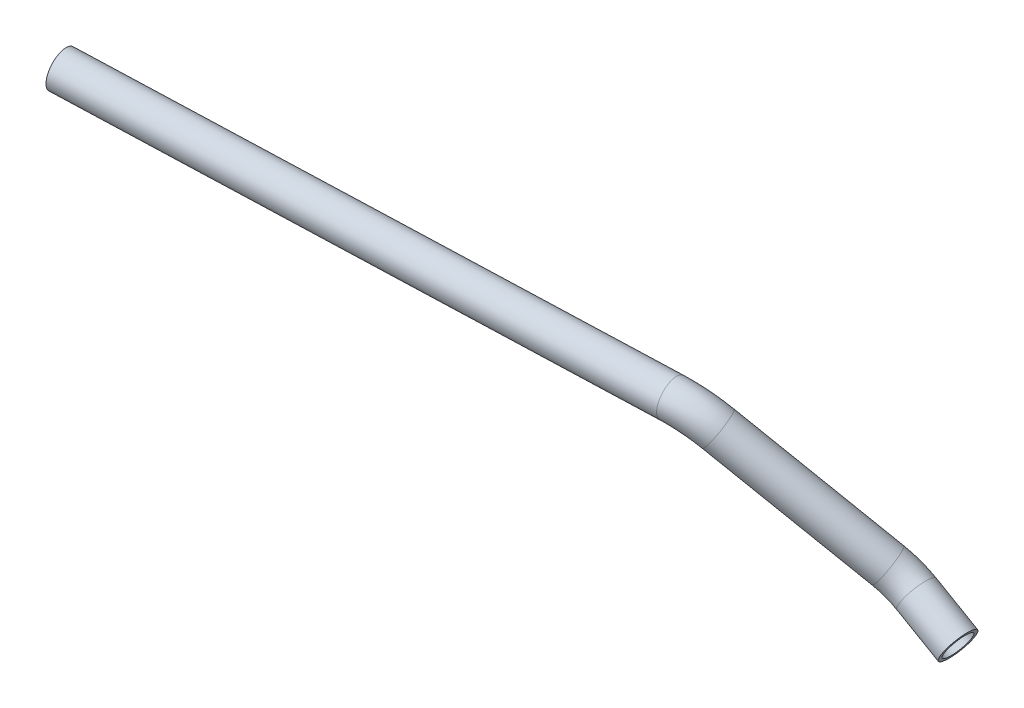
ISO-10303-21;
HEADER;
FILE_DESCRIPTION(('STEP AP214'),'2;1');
FILE_NAME('part.step','',(''),(''),'','','');
FILE_SCHEMA(('AUTOMOTIVE_DESIGN { 1 0 10303 214 1 1 1 1 }'));
ENDSEC;
DATA;
#1=APPLICATION_CONTEXT('core data for automotive mechanical design processes');
#2=APPLICATION_PROTOCOL_DEFINITION('international standard','automotive_design',2000,#1);
#3=PRODUCT_CONTEXT('',#1,'mechanical');
#4=PRODUCT('Part','Part','',(#3));
#5=PRODUCT_RELATED_PRODUCT_CATEGORY('part','',(#4));
#6=PRODUCT_DEFINITION_FORMATION('','',#4);
#7=PRODUCT_DEFINITION_CONTEXT('part definition',#1,'design');
#8=PRODUCT_DEFINITION('design','',#6,#7);
#9=PRODUCT_DEFINITION_SHAPE('','',#8);
#10=(LENGTH_UNIT() NAMED_UNIT(*) SI_UNIT(.MILLI.,.METRE.));
#11=(NAMED_UNIT(*) PLANE_ANGLE_UNIT() SI_UNIT($,.RADIAN.));
#12=(NAMED_UNIT(*) SI_UNIT($,.STERADIAN.) SOLID_ANGLE_UNIT());
#13=UNCERTAINTY_MEASURE_WITH_UNIT(LENGTH_MEASURE(1.E-05),#10,'distance_accuracy_value','');
#14=(GEOMETRIC_REPRESENTATION_CONTEXT(3) GLOBAL_UNCERTAINTY_ASSIGNED_CONTEXT((#13)) GLOBAL_UNIT_ASSIGNED_CONTEXT((#10,
#11,#12)) REPRESENTATION_CONTEXT('',''));
#15=CARTESIAN_POINT('',(0.,0.,0.));
#16=DIRECTION('',(0.,0.,1.));
#17=DIRECTION('',(1.,0.,0.));
#18=AXIS2_PLACEMENT_3D('',#15,#16,#17);
#19=CARTESIAN_POINT('',(-10.2697976298578,5.92927042612137,0.));
#20=DIRECTION('',(0.866025403784438,-0.500000000000001,0.));
#21=DIRECTION('',(0.500000000000001,0.866025403784438,0.));
#22=AXIS2_PLACEMENT_3D('',#19,#20,#21);
#23=CYLINDRICAL_SURFACE('',#22,10.);
#24=CARTESIAN_POINT('',(-10.2697976298578,5.92927042612137,0.));
#25=DIRECTION('',(-0.866025403784438,0.500000000000001,0.));
#26=DIRECTION('',(0.0703914326031933,0.121921537686291,0.990040496577933));
#27=AXIS2_PLACEMENT_3D('',#24,#25,#26);
#28=CIRCLE('',#27,10.);
#29=CARTESIAN_POINT('',(-12.0494275557873,2.84686097574138,-9.34514148137651));
#30=VERTEX_POINT('',#29);
#31=EDGE_CURVE('E114',#30,#30,#28,.T.);
#32=ORIENTED_EDGE('',*,*,#31,.F.);
#33=EDGE_LOOP('',(#32));
#34=FACE_BOUND('',#33,.T.);
#35=CARTESIAN_POINT('',(12.9903810567664,-7.49999999999996,0.));
#36=DIRECTION('',(-0.866025403784438,0.500000000000001,0.));
#37=DIRECTION('',(0.0703914326031933,0.121921537686291,0.990040496577933));
#38=AXIS2_PLACEMENT_3D('',#35,#36,#37);
#39=CIRCLE('',#38,10.);
#40=CARTESIAN_POINT('',(13.6942953827984,-6.28078462313704,9.90040496577936));
#41=VERTEX_POINT('',#40);
#42=EDGE_CURVE('E46',#41,#41,#39,.T.);
#43=ORIENTED_EDGE('',*,*,#42,.T.);
#44=EDGE_LOOP('',(#43));
#45=FACE_BOUND('',#44,.T.);
#46=ADVANCED_FACE('F33',(#34,#45),#23,.T.);
#47=CARTESIAN_POINT('',(-10.2697976298578,5.92927042612137,0.));
#48=DIRECTION('',(0.866025403784438,-0.500000000000001,0.));
#49=DIRECTION('',(0.500000000000001,0.866025403784438,0.));
#50=AXIS2_PLACEMENT_3D('',#47,#48,#49);
#51=CYLINDRICAL_SURFACE('',#50,8.00000000000001);
#52=CARTESIAN_POINT('',(8.06217782649094,-3.49999999999992,-7.93725393313693));
#53=CARTESIAN_POINT('',(8.06217478599125,-3.3868147194185,-7.92490374768489));
#54=CARTESIAN_POINT('',(8.05254486445534,-3.27372120669309,-7.91131468549269));
#55=CARTESIAN_POINT('',(8.0143703836225,-3.05083533555484,-7.88316799635768));
#56=CARTESIAN_POINT('',(7.98581043385471,-2.94104573927897,-7.86860958999037));
#57=CARTESIAN_POINT('',(7.91054713247679,-2.72778876856143,-7.84016337768201));
#58=CARTESIAN_POINT('',(7.86384684359413,-2.62432033029679,-7.82627545898382));
#59=CARTESIAN_POINT('',(7.75349593584393,-2.42656681091997,-7.8007646557242));
#60=CARTESIAN_POINT('',(7.68984970216507,-2.33227936260465,-7.78914118652521));
#61=CARTESIAN_POINT('',(7.54775472395503,-2.15621059387384,-7.76961018579242));
#62=CARTESIAN_POINT('',(7.46940884095756,-2.07434912100449,-7.76167809111523));
#63=CARTESIAN_POINT('',(7.29983967111227,-1.92489401345941,-7.75039341012516));
#64=CARTESIAN_POINT('',(7.20861875634432,-1.85729775628941,-7.74703998145656));
#65=CARTESIAN_POINT('',(7.01880910287182,-1.74018880848084,-7.74535826955316));
#66=CARTESIAN_POINT('',(6.92050732781808,-1.69021238176538,-7.7468883852453));
#67=CARTESIAN_POINT('',(6.71719208841107,-1.60711417134894,-7.75447937950912));
#68=CARTESIAN_POINT('',(6.61217873360344,-1.57399211263194,-7.76054018414867));
#69=CARTESIAN_POINT('',(6.39897348684287,-1.52554738714832,-7.77643815056397));
#70=CARTESIAN_POINT('',(6.29080012442414,-1.51013650391132,-7.78625626858658));
#71=CARTESIAN_POINT('',(6.07366078865178,-1.49707631600811,-7.80856902915444));
#72=CARTESIAN_POINT('',(5.96469469538854,-1.49942975665448,-7.82106408510585));
#73=CARTESIAN_POINT('',(5.74587647389668,-1.5220289721801,-7.84773633959301));
#74=CARTESIAN_POINT('',(5.63607748596598,-1.54274760004424,-7.86194936084698));
#75=CARTESIAN_POINT('',(5.42142043051104,-1.60214999267251,-7.89022260631002));
#76=CARTESIAN_POINT('',(5.31656297283914,-1.64083596849076,-7.90428281149561));
#77=CARTESIAN_POINT('',(5.11282854149565,-1.73603001726403,-7.93095587591112));
#78=CARTESIAN_POINT('',(5.01408463771778,-1.79283178119338,-7.94353984551123));
#79=CARTESIAN_POINT('',(4.82742989991539,-1.92256223889068,-7.96555637483007));
#80=CARTESIAN_POINT('',(4.73951762997588,-1.99548879145729,-7.97498935255001));
#81=CARTESIAN_POINT('',(4.57862603109234,-2.15404137261695,-7.98949531184776));
#82=CARTESIAN_POINT('',(4.50541155587918,-2.23942187016009,-7.99464195711137));
#83=CARTESIAN_POINT('',(4.37426429563043,-2.42133616130928,-8.00026927352975));
#84=CARTESIAN_POINT('',(4.31632903563768,-2.51786814492846,-8.00075070081779));
#85=CARTESIAN_POINT('',(4.21867162401703,-2.71675998385006,-7.99704121616749));
#86=CARTESIAN_POINT('',(4.17854444658413,-2.81892349787001,-7.99296254938514));
#87=CARTESIAN_POINT('',(4.1155523293576,-3.02820316347132,-7.98075459485453));
#88=CARTESIAN_POINT('',(4.09268796989231,-3.13531948142384,-7.97262517094623));
#89=CARTESIAN_POINT('',(4.06463906339959,-3.35215312769744,-7.95312348964278));
#90=CARTESIAN_POINT('',(4.0595540059711,-3.4618816441787,-7.94173336850681));
#91=CARTESIAN_POINT('',(4.06733552459349,-3.68047214625907,-7.91692521572489));
#92=CARTESIAN_POINT('',(4.08020514091371,-3.7893339819635,-7.90350684097735));
#93=CARTESIAN_POINT('',(4.12408292391086,-4.00632847000852,-7.87566572913506));
#94=CARTESIAN_POINT('',(4.15557202629261,-4.11436185550258,-7.86122564701563));
#95=CARTESIAN_POINT('',(4.23624516791687,-4.32374685176637,-7.83327255871569));
#96=CARTESIAN_POINT('',(4.28543053552359,-4.42509796025725,-7.81975962222176));
#97=CARTESIAN_POINT('',(4.40076333300351,-4.61917315779605,-7.79509190852995));
#98=CARTESIAN_POINT('',(4.46705198301816,-4.71181621168889,-7.78395824771177));
#99=CARTESIAN_POINT('',(4.61461171583183,-4.88472488652692,-7.76554256063966));
#100=CARTESIAN_POINT('',(4.69587978117963,-4.96499299430982,-7.7582597598101));
#101=CARTESIAN_POINT('',(4.86890056840939,-5.10886160032097,-7.74857824888599));
#102=CARTESIAN_POINT('',(4.96034647329295,-5.17282329571651,-7.74606388672052));
#103=CARTESIAN_POINT('',(5.15259157080217,-5.28466122389379,-7.74587512062454));
#104=CARTESIAN_POINT('',(5.25338965810858,-5.33253935448316,-7.74820014542918));
#105=CARTESIAN_POINT('',(5.45930511479483,-5.41008246544968,-7.75731201109152));
#106=CARTESIAN_POINT('',(5.56429986761818,-5.44008451958381,-7.76401092819155));
#107=CARTESIAN_POINT('',(5.777483741264,-5.4826162077832,-7.78101040537414));
#108=CARTESIAN_POINT('',(5.88567319364414,-5.49514402175315,-7.79131134049872));
#109=CARTESIAN_POINT('',(6.10417631622196,-5.50259425711637,-7.81456461661609));
#110=CARTESIAN_POINT('',(6.21449553254976,-5.49722217119914,-7.82755797931081));
#111=CARTESIAN_POINT('',(6.43262805878351,-5.46846991014122,-7.85466227744665));
#112=CARTESIAN_POINT('',(6.54044093709116,-5.44508665674784,-7.86877340355259));
#113=CARTESIAN_POINT('',(6.75363675383314,-5.38006155429071,-7.89698163821767));
#114=CARTESIAN_POINT('',(6.85887777551744,-5.33794849939385,-7.91106829607877));
#115=CARTESIAN_POINT('',(7.06094503495474,-5.23644623070366,-7.93726756680363));
#116=CARTESIAN_POINT('',(7.15777158863445,-5.17705766589498,-7.94938025379638));
#117=CARTESIAN_POINT('',(7.33989144940927,-5.04278895221189,-7.97023620049024));
#118=CARTESIAN_POINT('',(7.42522552307477,-4.96796608027079,-7.97899158516593));
#119=CARTESIAN_POINT('',(7.58217645453357,-4.80476612662237,-7.9921984728253));
#120=CARTESIAN_POINT('',(7.65379450188576,-4.71639022153614,-7.99665034917787));
#121=CARTESIAN_POINT('',(7.77936476894339,-4.53123686960082,-8.00068336973662));
#122=CARTESIAN_POINT('',(7.83373861409928,-4.43474769842867,-8.00039172483479));
#123=CARTESIAN_POINT('',(7.92577667575456,-4.23426830761943,-7.9952792469473));
#124=CARTESIAN_POINT('',(7.96345110038325,-4.13028271577149,-7.99046118653326));
#125=CARTESIAN_POINT('',(8.01550505373281,-3.93860008521625,-7.97816977111501));
#126=CARTESIAN_POINT('',(8.0329962318095,-3.85168567616473,-7.97139831013582));
#127=CARTESIAN_POINT('',(8.05633413616127,-3.67649564648312,-7.95575350077177));
#128=CARTESIAN_POINT('',(8.06218019634613,-3.58821994827953,-7.94688003218644));
#129=CARTESIAN_POINT('',(8.06217782649094,-3.49999999999992,-7.93725393313693));
#130=B_SPLINE_CURVE_WITH_KNOTS('',3,(#52,#53,#54,#55,#56,#57,#58,#59,#60,#61,#62,#63,#64,#65,
#66,#67,#68,#69,#70,#71,#72,#73,#74,#75,#76,#77,#78,#79,#80,#81,#82,#83,#84,#85,#86,#87,#88,#89,
#90,#91,#92,#93,#94,#95,#96,#97,#98,#99,#100,#101,#102,#103,#104,#105,#106,#107,#108,#109,#110,
#111,#112,#113,#114,#115,#116,#117,#118,#119,#120,#121,#122,#123,#124,#125,#126,#127,#128,#129),
.UNSPECIFIED.,.T.,.F.,(4,2,2,2,2,2,2,2,2,2,2,2,2,2,2,2,2,2,2,2,2,2,2,2,2,2,2,2,2,2,2,2,2,2,2,2,
2,2,4),(0.,0.34124814598429,0.682774074034849,1.02424236553805,1.36562237928526,1.7046971035357,
2.04370943842851,2.37298218689826,2.70224956238766,3.0298697044704,3.35754047826411,
3.6939011451632,4.0303032154333,4.37246276233034,4.71457690131674,5.05068259496939,
5.38673381207893,5.71469187636746,6.04266096521112,6.3724623951495,6.70231967722425,
7.04109401334996,7.37989378476474,7.72158588275912,8.06320922542177,8.39643537445941,
8.72962219008708,9.05630935584843,9.38303054640208,9.71515365412977,10.0473335369531,
10.3883898682872,10.7294333889001,11.0692333546117,11.409003836908,11.7396778013094,
12.070149349495,12.3361130137614,12.6020918904723),.UNSPECIFIED.);
#131=CARTESIAN_POINT('',(8.06217782649094,-3.49999999999992,-7.93725393313693));
#132=VERTEX_POINT('',#131);
#133=EDGE_CURVE('E10',#132,#132,#130,.T.);
#134=ORIENTED_EDGE('',*,*,#133,.F.);
#135=EDGE_LOOP('',(#134));
#136=FACE_BOUND('',#135,.T.);
#137=CARTESIAN_POINT('',(8.06217782649094,-3.49999999999992,7.93725393325062));
#138=CARTESIAN_POINT('',(8.06217564053699,-3.60989176571201,7.94924285693887));
#139=CARTESIAN_POINT('',(8.05309916425535,-3.71993803622657,7.96007089619005));
#140=CARTESIAN_POINT('',(8.01688460293893,-3.93734332318027,7.97824552477793));
#141=CARTESIAN_POINT('',(7.98974250982244,-4.04470173779944,7.98559134092076));
#142=CARTESIAN_POINT('',(7.91800294944832,-4.25374409295078,7.99600407824409));
#143=CARTESIAN_POINT('',(7.87339240804499,-4.35542371794783,7.99906778664297));
#144=CARTESIAN_POINT('',(7.76796016251197,-4.55002443983084,8.00056546507311));
#145=CARTESIAN_POINT('',(7.70714024428513,-4.64294650007451,7.99899994494785));
#146=CARTESIAN_POINT('',(7.57196669885257,-4.81622942528777,7.99146377000274));
#147=CARTESIAN_POINT('',(7.49779596814189,-4.89673564692192,7.98554966910932));
#148=CARTESIAN_POINT('',(7.33755350402537,-5.04443971557158,7.97001376281799));
#149=CARTESIAN_POINT('',(7.25148071605406,-5.11163638202748,7.96039162873973));
#150=CARTESIAN_POINT('',(7.06866204912666,-5.23179312944292,7.93830741298));
#151=CARTESIAN_POINT('',(6.971794404561,-5.28456137966059,7.92581078532208));
#152=CARTESIAN_POINT('',(6.77087903668193,-5.37345003882091,7.89936520195478));
#153=CARTESIAN_POINT('',(6.66683006278527,-5.4095675396878,7.88541599307126));
#154=CARTESIAN_POINT('',(6.45138679978217,-5.46499672698059,7.85716166074223));
#155=CARTESIAN_POINT('',(6.33987087019911,-5.48383710146221,7.84285691357853));
#156=CARTESIAN_POINT('',(6.11505507872777,-5.50247990542869,7.8158738863039));
#157=CARTESIAN_POINT('',(6.00175519510773,-5.5022821028147,7.80319562602373));
#158=CARTESIAN_POINT('',(5.7764270631449,-5.48271024115657,7.78093853117743));
#159=CARTESIAN_POINT('',(5.66439961837707,-5.46332467907515,7.77136156040122));
#160=CARTESIAN_POINT('',(5.4449882892551,-5.40576313057062,7.75649079006911));
#161=CARTESIAN_POINT('',(5.33760338171273,-5.36759130773381,7.75119604213405));
#162=CARTESIAN_POINT('',(5.13364681584992,-5.27483264397386,7.74563470788963));
#163=CARTESIAN_POINT('',(5.03685731597129,-5.22073250191898,7.74523221093265));
#164=CARTESIAN_POINT('',(4.85360497414581,-5.09735737684167,7.74915178052354));
#165=CARTESIAN_POINT('',(4.76714147790304,-5.02808335608463,7.75347354754722));
#166=CARTESIAN_POINT('',(4.60798328544992,-4.8773824088467,7.76623971729903));
#167=CARTESIAN_POINT('',(4.535130136551,-4.79611804146974,7.77463196552094));
#168=CARTESIAN_POINT('',(4.40372483143421,-4.62309368695471,7.79456096824324));
#169=CARTESIAN_POINT('',(4.34517459135638,-4.53133229596069,7.8060981436274));
#170=CARTESIAN_POINT('',(4.24263371472163,-4.33758152437843,7.8313435743665));
#171=CARTESIAN_POINT('',(4.19900206486117,-4.23540784706927,7.84509500671211));
#172=CARTESIAN_POINT('',(4.12922413037599,-4.02530668884024,7.87306787038846));
#173=CARTESIAN_POINT('',(4.10308051740422,-3.91737833149412,7.88728937318391));
#174=CARTESIAN_POINT('',(4.06859339987651,-3.69606539323528,7.91498742203487));
#175=CARTESIAN_POINT('',(4.06066542666518,-3.58261263033371,7.92843987591229));
#176=CARTESIAN_POINT('',(4.06416560789765,-3.35572030198782,7.95273433107179));
#177=CARTESIAN_POINT('',(4.07559215723965,-3.24228073622928,7.96357654873979));
#178=CARTESIAN_POINT('',(4.11738911972234,-3.01995425132473,7.98131915875191));
#179=CARTESIAN_POINT('',(4.14754365265912,-2.91103033558887,7.98826277771333));
#180=CARTESIAN_POINT('',(4.22583997508143,-2.69965009433073,7.99760638084385));
#181=CARTESIAN_POINT('',(4.27397840893521,-2.59719256640593,8.00000721214912));
#182=CARTESIAN_POINT('',(4.38532598695394,-2.40445097372645,7.99999294228559));
#183=CARTESIAN_POINT('',(4.44810203231463,-2.31391629370147,7.99770375599539));
#184=CARTESIAN_POINT('',(4.58751642718014,-2.1444892166928,7.98881315822789));
#185=CARTESIAN_POINT('',(4.66415469844006,-2.06559675399954,7.98221177109011));
#186=CARTESIAN_POINT('',(4.82894788797131,-1.92167901111281,7.96541932098452));
#187=CARTESIAN_POINT('',(4.91708635980826,-1.85663427038432,7.95523334968191));
#188=CARTESIAN_POINT('',(5.10254022931105,-1.74187847121478,7.9323403847335));
#189=CARTESIAN_POINT('',(5.19985702621481,-1.69216975570424,7.91963300637155));
#190=CARTESIAN_POINT('',(5.40371228237341,-1.60820639662699,7.89267063267229));
#191=CARTESIAN_POINT('',(5.51042302078234,-1.5743798785539,7.87838435002829));
#192=CARTESIAN_POINT('',(5.72803304608757,-1.52495582880603,7.85009439805731));
#193=CARTESIAN_POINT('',(5.83893284482307,-1.50936053219406,7.83609076358846));
#194=CARTESIAN_POINT('',(6.06370456407893,-1.49678872217788,7.80972185529822));
#195=CARTESIAN_POINT('',(6.17759605780404,-1.50009788450634,7.79738461913391));
#196=CARTESIAN_POINT('',(6.40347453186602,-1.52606121929466,7.77607145060102));
#197=CARTESIAN_POINT('',(6.51546181671738,-1.54871226842136,7.7670949758724));
#198=CARTESIAN_POINT('',(6.7320499664308,-1.61220902079278,7.75374695697586));
#199=CARTESIAN_POINT('',(6.83675275597208,-1.65268831016604,7.74928836011729));
#200=CARTESIAN_POINT('',(7.03798397216719,-1.75062347798171,7.74521999244904));
#201=CARTESIAN_POINT('',(7.13451384079498,-1.80807635365733,7.74560936449471));
#202=CARTESIAN_POINT('',(7.31427606796084,-1.93661832905546,7.75111611131635));
#203=CARTESIAN_POINT('',(7.39777666987418,-2.00733809345104,7.75611719653562));
#204=CARTESIAN_POINT('',(7.55199804236721,-2.16122991191534,7.77009640721846));
#205=CARTESIAN_POINT('',(7.62271686658083,-2.24440385894506,7.77907513766725));
#206=CARTESIAN_POINT('',(7.75018771099483,-2.42173001623093,7.80009711725423));
#207=CARTESIAN_POINT('',(7.80679640234632,-2.51598161978183,7.81216947281805));
#208=CARTESIAN_POINT('',(7.90376503729237,-2.71225991557749,7.83800002924578));
#209=CARTESIAN_POINT('',(7.94412872786273,-2.81428480841702,7.85175784039643));
#210=CARTESIAN_POINT('',(8.00443189836182,-3.01286465800936,7.87808405740253));
#211=CARTESIAN_POINT('',(8.02602898572885,-3.10892324504089,7.8906314007444));
#212=CARTESIAN_POINT('',(8.05490282523024,-3.30327993110253,7.91484753209153));
#213=CARTESIAN_POINT('',(8.06217978428972,-3.4015779977515,7.92651633278934));
#214=CARTESIAN_POINT('',(8.06217782649094,-3.49999999999992,7.93725393325062));
#215=B_SPLINE_CURVE_WITH_KNOTS('',3,(#137,#138,#139,#140,#141,#142,#143,#144,#145,#146,#147,
#148,#149,#150,#151,#152,#153,#154,#155,#156,#157,#158,#159,#160,#161,#162,#163,#164,#165,#166,
#167,#168,#169,#170,#171,#172,#173,#174,#175,#176,#177,#178,#179,#180,#181,#182,#183,#184,#185,
#186,#187,#188,#189,#190,#191,#192,#193,#194,#195,#196,#197,#198,#199,#200,#201,#202,#203,#204,
#205,#206,#207,#208,#209,#210,#211,#212,#213,#214),.UNSPECIFIED.,.T.,.F.,(4,2,2,2,2,2,2,2,2,2,2,
2,2,2,2,2,2,2,2,2,2,2,2,2,2,2,2,2,2,2,2,2,2,2,2,2,2,2,4),(0.,0.331290738966786,
0.662655003413866,0.994267750768152,1.32584397707042,1.65318261361502,1.98055027215735,
2.31207935909271,2.64366632611347,2.98405087474079,3.32443957307609,3.66503245767321,
4.00554989086938,4.33658513137576,4.66759938505476,4.99448016344591,5.32140470959666,
5.65571840669314,5.99008316534192,6.33200273173159,6.67389394356825,7.01191545537832,
7.34987392693595,7.67887803775989,8.00788029158828,8.33641709325846,8.66500406165438,
9.00200147169603,9.33904019171861,9.68118543136371,10.023275431748,10.3586408033136,
10.6939468814813,11.0210224375811,11.3481477577602,11.6784717106648,12.0087194292746,
12.3054365564749,12.6021493960965),.UNSPECIFIED.);
#216=CARTESIAN_POINT('',(8.06217782649094,-3.49999999999992,7.93725393325062));
#217=VERTEX_POINT('',#216);
#218=EDGE_CURVE('E42',#217,#217,#215,.T.);
#219=ORIENTED_EDGE('',*,*,#218,.F.);
#220=EDGE_LOOP('',(#219));
#221=FACE_BOUND('',#220,.T.);
#222=CARTESIAN_POINT('',(-10.2697976298578,5.92927042612137,0.));
#223=DIRECTION('',(-0.866025403784438,0.500000000000001,0.));
#224=DIRECTION('',(0.0703914326031933,0.121921537686291,0.990040496577933));
#225=AXIS2_PLACEMENT_3D('',#222,#223,#224);
#226=CIRCLE('',#225,8.00000000000001);
#227=CARTESIAN_POINT('',(-11.6935015706014,3.46334286581738,-7.4761131851012));
#228=VERTEX_POINT('',#227);
#229=EDGE_CURVE('E117',#228,#228,#226,.T.);
#230=ORIENTED_EDGE('',*,*,#229,.T.);
#231=EDGE_LOOP('',(#230));
#232=FACE_BOUND('',#231,.T.);
#233=CARTESIAN_POINT('',(12.9903810567664,-7.49999999999996,0.));
#234=DIRECTION('',(-0.866025403784438,0.500000000000001,0.));
#235=DIRECTION('',(0.0703914326031933,0.121921537686291,0.990040496577933));
#236=AXIS2_PLACEMENT_3D('',#233,#234,#235);
#237=CIRCLE('',#236,8.00000000000001);
#238=CARTESIAN_POINT('',(13.553512517592,-6.52462769850962,7.92032397262349));
#239=VERTEX_POINT('',#238);
#240=EDGE_CURVE('E50',#239,#239,#237,.T.);
#241=ORIENTED_EDGE('',*,*,#240,.F.);
#242=EDGE_LOOP('',(#241));
#243=FACE_BOUND('',#242,.T.);
#244=ADVANCED_FACE('F55',(#136,#221,#232,#243),#51,.F.);
#245=CARTESIAN_POINT('',(-3.15127792613946,18.2589082276413,37.3805659255061));
#246=DIRECTION('',(-0.467257074068827,-0.80931299248318,0.355925985185908));
#247=DIRECTION('',(0.866025403784438,-0.500000000000001,0.));
#248=AXIS2_PLACEMENT_3D('',#245,#246,#247);
#249=TOROIDAL_SURFACE('',#248,40.,10.);
#250=CARTESIAN_POINT('',(-23.2439382936822,14.7277944849773,2.97393524055023));
#251=DIRECTION('',(-0.727563709464162,0.580706037968567,0.365282830335067));
#252=DIRECTION('',(0.386738325221858,-0.0926118035014206,0.917527395589258));
#253=AXIS2_PLACEMENT_3D('',#250,#251,#252);
#254=CIRCLE('',#253,10.);
#255=CARTESIAN_POINT('',(-28.2671033855679,13.8450160493113,-5.62772243068875));
#256=VERTEX_POINT('',#255);
#257=EDGE_CURVE('E121',#256,#256,#254,.T.);
#258=CARTESIAN_POINT('',(-3.15127792613946,18.2589082276413,37.3805659255061));
#259=DIRECTION('',(-0.467257074068827,-0.80931299248318,0.355925985185908));
#260=DIRECTION('',(0.866025403784438,-0.500000000000001,0.));
#261=AXIS2_PLACEMENT_3D('',#258,#259,#260);
#262=CIRCLE('',#261,50.);
#263=EDGE_CURVE('',#256,#30,#262,.T.);
#264=ORIENTED_EDGE('',*,*,#257,.F.);
#265=ORIENTED_EDGE('',*,*,#31,.T.);
#266=ORIENTED_EDGE('',*,*,#263,.T.);
#267=ORIENTED_EDGE('',*,*,#263,.F.);
#268=EDGE_LOOP('',(#264,#266,#265,#267));
#269=FACE_BOUND('',#268,.T.);
#270=ADVANCED_FACE('F97',(#269),#249,.T.);
#271=CARTESIAN_POINT('',(-3.15127792613946,18.2589082276413,37.3805659255061));
#272=DIRECTION('',(-0.467257074068827,-0.80931299248318,0.355925985185908));
#273=DIRECTION('',(0.866025403784438,-0.500000000000001,0.));
#274=AXIS2_PLACEMENT_3D('',#271,#272,#273);
#275=TOROIDAL_SURFACE('',#274,40.,8.00000000000001);
#276=CARTESIAN_POINT('',(-23.2439382936822,14.7277944849773,2.97393524055023));
#277=DIRECTION('',(-0.727563709464162,0.580706037968567,0.365282830335067));
#278=DIRECTION('',(0.386738325221858,-0.0926118035014206,0.917527395589258));
#279=AXIS2_PLACEMENT_3D('',#276,#277,#278);
#280=CIRCLE('',#279,8.00000000000001);
#281=CARTESIAN_POINT('',(-27.2624703671908,14.0215717364445,-3.90739089644095));
#282=VERTEX_POINT('',#281);
#283=EDGE_CURVE('E126',#282,#282,#280,.T.);
#284=CARTESIAN_POINT('',(-3.15127792613946,18.2589082276413,37.3805659255061));
#285=DIRECTION('',(-0.467257074068827,-0.80931299248318,0.355925985185908));
#286=DIRECTION('',(0.866025403784438,-0.500000000000001,0.));
#287=AXIS2_PLACEMENT_3D('',#284,#285,#286);
#288=CIRCLE('',#287,48.);
#289=EDGE_CURVE('',#282,#228,#288,.T.);
#290=ORIENTED_EDGE('',*,*,#283,.T.);
#291=ORIENTED_EDGE('',*,*,#229,.F.);
#292=ORIENTED_EDGE('',*,*,#289,.T.);
#293=ORIENTED_EDGE('',*,*,#289,.F.);
#294=EDGE_LOOP('',(#290,#292,#291,#293));
#295=FACE_BOUND('',#294,.T.);
#296=ADVANCED_FACE('F94',(#295),#275,.F.);
#297=CARTESIAN_POINT('',(-86.4803632573448,65.2000394832744,34.7226054814146));
#298=DIRECTION('',(0.727563709464163,-0.580706037968567,-0.365282830335066));
#299=DIRECTION('',(0.623813693905332,0.781573077387,0.));
#300=AXIS2_PLACEMENT_3D('',#297,#298,#299);
#301=CYLINDRICAL_SURFACE('',#300,10.);
#302=CARTESIAN_POINT('',(-86.4803632573448,65.2000394832744,34.7226054814146));
#303=DIRECTION('',(-0.727563709464162,0.580706037968567,0.365282830335067));
#304=DIRECTION('',(0.386738325221858,-0.0926118035014206,0.917527395589258));
#305=AXIS2_PLACEMENT_3D('',#302,#303,#304);
#306=CIRCLE('',#305,10.);
#307=CARTESIAN_POINT('',(-79.6795755066793,72.0054669379333,37.449406378028));
#308=VERTEX_POINT('',#307);
#309=EDGE_CURVE('E129',#308,#308,#306,.T.);
#310=ORIENTED_EDGE('',*,*,#309,.F.);
#311=EDGE_LOOP('',(#310));
#312=FACE_BOUND('',#311,.T.);
#313=ORIENTED_EDGE('',*,*,#257,.T.);
#314=EDGE_LOOP('',(#313));
#315=FACE_BOUND('',#314,.T.);
#316=ADVANCED_FACE('F90',(#312,#315),#301,.T.);
#317=CARTESIAN_POINT('',(-86.4803632573448,65.2000394832744,34.7226054814146));
#318=DIRECTION('',(0.727563709464163,-0.580706037968567,-0.365282830335066));
#319=DIRECTION('',(0.623813693905332,0.781573077387,0.));
#320=AXIS2_PLACEMENT_3D('',#317,#318,#319);
#321=CYLINDRICAL_SURFACE('',#320,8.00000000000001);
#322=CARTESIAN_POINT('',(-86.4803632573448,65.2000394832744,34.7226054814146));
#323=DIRECTION('',(-0.727563709464162,0.580706037968567,0.365282830335067));
#324=DIRECTION('',(0.386738325221858,-0.0926118035014206,0.917527395589258));
#325=AXIS2_PLACEMENT_3D('',#322,#323,#324);
#326=CIRCLE('',#325,8.00000000000001);
#327=CARTESIAN_POINT('',(-81.0397330568124,70.6443814470015,36.9040461987053));
#328=VERTEX_POINT('',#327);
#329=EDGE_CURVE('E132',#328,#328,#326,.T.);
#330=ORIENTED_EDGE('',*,*,#329,.T.);
#331=EDGE_LOOP('',(#330));
#332=FACE_BOUND('',#331,.T.);
#333=ORIENTED_EDGE('',*,*,#283,.F.);
#334=EDGE_LOOP('',(#333));
#335=FACE_BOUND('',#334,.T.);
#336=ADVANCED_FACE('F86',(#332,#335),#321,.F.);
#337=CARTESIAN_POINT('',(-113.683514260007,37.9783296646385,23.8154018949607));
#338=DIRECTION('',(-0.090243605727626,0.446813237338144,-0.890064055315506));
#339=DIRECTION('',(0.,0.893710643661308,0.448643829118923));
#340=AXIS2_PLACEMENT_3D('',#337,#338,#339);
#341=TOROIDAL_SURFACE('',#340,40.,10.);
#342=CARTESIAN_POINT('',(-106.469208032964,73.428950509025,40.8801980381908));
#343=DIRECTION('',(-0.979452504036977,0.122030148043951,0.160565984268357));
#344=DIRECTION('',(0.161775027066481,0.,0.986827665105534));
#345=AXIS2_PLACEMENT_3D('',#342,#343,#344);
#346=CIRCLE('',#345,10.);
#347=CARTESIAN_POINT('',(-104.665631476203,82.2916057201216,45.1463970739983));
#348=VERTEX_POINT('',#347);
#349=EDGE_CURVE('E135',#348,#348,#346,.T.);
#350=CARTESIAN_POINT('',(-113.683514260007,37.9783296646385,23.8154018949607));
#351=DIRECTION('',(-0.090243605727626,0.446813237338144,-0.890064055315506));
#352=DIRECTION('',(0.,0.893710643661308,0.448643829118923));
#353=AXIS2_PLACEMENT_3D('',#350,#351,#352);
#354=CIRCLE('',#353,50.);
#355=EDGE_CURVE('',#348,#308,#354,.T.);
#356=ORIENTED_EDGE('',*,*,#349,.F.);
#357=ORIENTED_EDGE('',*,*,#309,.T.);
#358=ORIENTED_EDGE('',*,*,#355,.T.);
#359=ORIENTED_EDGE('',*,*,#355,.F.);
#360=EDGE_LOOP('',(#356,#358,#357,#359));
#361=FACE_BOUND('',#360,.T.);
#362=ADVANCED_FACE('F82',(#361),#341,.T.);
#363=CARTESIAN_POINT('',(-113.683514260007,37.9783296646385,23.8154018949607));
#364=DIRECTION('',(-0.090243605727626,0.446813237338144,-0.890064055315506));
#365=DIRECTION('',(0.,0.893710643661308,0.448643829118923));
#366=AXIS2_PLACEMENT_3D('',#363,#364,#365);
#367=TOROIDAL_SURFACE('',#366,40.,8.00000000000001);
#368=CARTESIAN_POINT('',(-106.469208032964,73.428950509025,40.8801980381908));
#369=DIRECTION('',(-0.979452504036977,0.122030148043951,0.160565984268357));
#370=DIRECTION('',(0.161775027066481,0.,0.986827665105534));
#371=AXIS2_PLACEMENT_3D('',#368,#369,#370);
#372=CIRCLE('',#371,8.00000000000001);
#373=CARTESIAN_POINT('',(-105.026346787555,80.5190746779023,44.2931572668368));
#374=VERTEX_POINT('',#373);
#375=EDGE_CURVE('E138',#374,#374,#372,.T.);
#376=CARTESIAN_POINT('',(-113.683514260007,37.9783296646385,23.8154018949607));
#377=DIRECTION('',(-0.090243605727626,0.446813237338144,-0.890064055315506));
#378=DIRECTION('',(0.,0.893710643661308,0.448643829118923));
#379=AXIS2_PLACEMENT_3D('',#376,#377,#378);
#380=CIRCLE('',#379,48.);
#381=EDGE_CURVE('',#374,#328,#380,.T.);
#382=ORIENTED_EDGE('',*,*,#375,.T.);
#383=ORIENTED_EDGE('',*,*,#329,.F.);
#384=ORIENTED_EDGE('',*,*,#381,.T.);
#385=ORIENTED_EDGE('',*,*,#381,.F.);
#386=EDGE_LOOP('',(#382,#384,#383,#385));
#387=FACE_BOUND('',#386,.T.);
#388=ADVANCED_FACE('F78',(#387),#367,.F.);
#389=CARTESIAN_POINT('',(-106.469208032964,73.428950509025,40.8801980381908));
#390=DIRECTION('',(-0.979452504036977,0.122030148043951,0.160565984268357));
#391=DIRECTION('',(0.161775027066481,0.,0.986827665105534));
#392=AXIS2_PLACEMENT_3D('',#389,#390,#391);
#393=CYLINDRICAL_SURFACE('',#392,8.00000000000001);
#394=ORIENTED_EDGE('',*,*,#375,.F.);
#395=EDGE_LOOP('',(#394));
#396=FACE_BOUND('',#395,.T.);
#397=CARTESIAN_POINT('',(-400.,110.,89.));
#398=DIRECTION('',(-0.979452504036977,0.122030148043951,0.160565984268357));
#399=DIRECTION('',(0.161775027066481,0.,0.986827665105534));
#400=AXIS2_PLACEMENT_3D('',#397,#398,#399);
#401=CIRCLE('',#400,8.00000000000001);
#402=CARTESIAN_POINT('',(-398.705799783468,110.,96.8946213208443));
#403=VERTEX_POINT('',#402);
#404=EDGE_CURVE('E144',#403,#403,#401,.T.);
#405=ORIENTED_EDGE('',*,*,#404,.T.);
#406=EDGE_LOOP('',(#405));
#407=FACE_BOUND('',#406,.T.);
#408=ADVANCED_FACE('F74',(#396,#407),#393,.F.);
#409=CARTESIAN_POINT('',(-106.469208032964,73.428950509025,40.8801980381908));
#410=DIRECTION('',(-0.979452504036977,0.122030148043951,0.160565984268357));
#411=DIRECTION('',(0.161775027066481,0.,0.986827665105534));
#412=AXIS2_PLACEMENT_3D('',#409,#410,#411);
#413=CYLINDRICAL_SURFACE('',#412,10.);
#414=ORIENTED_EDGE('',*,*,#349,.T.);
#415=EDGE_LOOP('',(#414));
#416=FACE_BOUND('',#415,.T.);
#417=CARTESIAN_POINT('',(-400.,110.,89.));
#418=DIRECTION('',(-0.979452504036977,0.122030148043951,0.160565984268357));
#419=DIRECTION('',(0.161775027066481,0.,0.986827665105534));
#420=AXIS2_PLACEMENT_3D('',#417,#418,#419);
#421=CIRCLE('',#420,10.);
#422=CARTESIAN_POINT('',(-398.382249729335,110.,98.8682766510554));
#423=VERTEX_POINT('',#422);
#424=EDGE_CURVE('E141',#423,#423,#421,.T.);
#425=ORIENTED_EDGE('',*,*,#424,.F.);
#426=EDGE_LOOP('',(#425));
#427=FACE_BOUND('',#426,.T.);
#428=ADVANCED_FACE('F70',(#416,#427),#413,.T.);
#429=CARTESIAN_POINT('',(12.9903810567664,-7.49999999999996,0.));
#430=DIRECTION('',(-0.866025403784438,0.500000000000001,0.));
#431=DIRECTION('',(0.0703914326031933,0.121921537686291,0.990040496577933));
#432=AXIS2_PLACEMENT_3D('',#429,#430,#431);
#433=PLANE('',#432);
#434=ORIENTED_EDGE('',*,*,#240,.T.);
#435=EDGE_LOOP('',(#434));
#436=FACE_BOUND('',#435,.T.);
#437=ORIENTED_EDGE('',*,*,#42,.F.);
#438=EDGE_LOOP('',(#437));
#439=FACE_BOUND('',#438,.T.);
#440=ADVANCED_FACE('F66',(#436,#439),#433,.F.);
#441=CARTESIAN_POINT('',(-400.,110.,89.));
#442=DIRECTION('',(-0.979452504036977,0.122030148043951,0.160565984268357));
#443=DIRECTION('',(0.161775027066481,0.,0.986827665105534));
#444=AXIS2_PLACEMENT_3D('',#441,#442,#443);
#445=PLANE('',#444);
#446=ORIENTED_EDGE('',*,*,#404,.F.);
#447=EDGE_LOOP('',(#446));
#448=FACE_BOUND('',#447,.T.);
#449=ORIENTED_EDGE('',*,*,#424,.T.);
#450=EDGE_LOOP('',(#449));
#451=FACE_BOUND('',#450,.T.);
#452=ADVANCED_FACE('F62',(#448,#451),#445,.T.);
#453=CARTESIAN_POINT('',(6.06217782649094,-3.49999999999992,-500000.));
#454=DIRECTION('',(0.,0.,1.));
#455=DIRECTION('',(1.,0.,0.));
#456=AXIS2_PLACEMENT_3D('',#453,#454,#455);
#457=CYLINDRICAL_SURFACE('',#456,2.);
#458=ORIENTED_EDGE('',*,*,#133,.T.);
#459=EDGE_LOOP('',(#458));
#460=FACE_BOUND('',#459,.T.);
#461=ORIENTED_EDGE('',*,*,#218,.T.);
#462=EDGE_LOOP('',(#461));
#463=FACE_BOUND('',#462,.T.);
#464=ADVANCED_FACE('F58',(#460,#463),#457,.T.);
#465=CLOSED_SHELL('',(#46,#244,#270,#296,#316,#336,#362,#388,#408,#428,#440,#452,#464));
#466=MANIFOLD_SOLID_BREP('B2',#465);
#467=ADVANCED_BREP_SHAPE_REPRESENTATION('',(#18,#466),#14);
#468=SHAPE_DEFINITION_REPRESENTATION(#9,#467);
ENDSEC;
END-ISO-10303-21;
